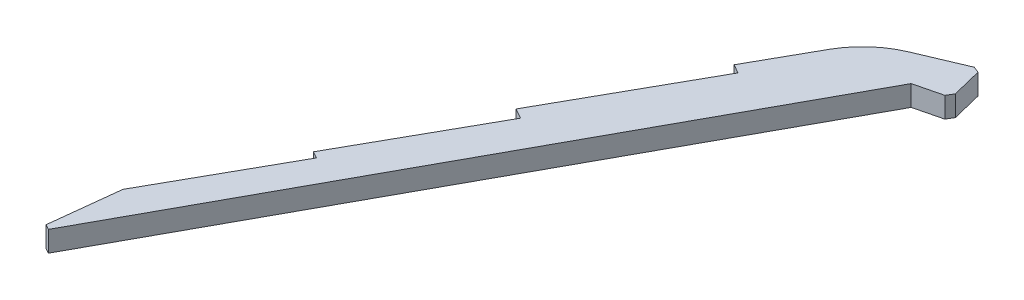
ISO-10303-21;
HEADER;
FILE_DESCRIPTION(('STEP AP214'),'2;1');
FILE_NAME('part.step','',(''),(''),'','','');
FILE_SCHEMA(('AUTOMOTIVE_DESIGN { 1 0 10303 214 1 1 1 1 }'));
ENDSEC;
DATA;
#1=APPLICATION_CONTEXT('core data for automotive mechanical design processes');
#2=APPLICATION_PROTOCOL_DEFINITION('international standard','automotive_design',2000,#1);
#3=PRODUCT_CONTEXT('',#1,'mechanical');
#4=PRODUCT('Part','Part','',(#3));
#5=PRODUCT_RELATED_PRODUCT_CATEGORY('part','',(#4));
#6=PRODUCT_DEFINITION_FORMATION('','',#4);
#7=PRODUCT_DEFINITION_CONTEXT('part definition',#1,'design');
#8=PRODUCT_DEFINITION('design','',#6,#7);
#9=PRODUCT_DEFINITION_SHAPE('','',#8);
#10=(LENGTH_UNIT() NAMED_UNIT(*) SI_UNIT(.MILLI.,.METRE.));
#11=(NAMED_UNIT(*) PLANE_ANGLE_UNIT() SI_UNIT($,.RADIAN.));
#12=(NAMED_UNIT(*) SI_UNIT($,.STERADIAN.) SOLID_ANGLE_UNIT());
#13=UNCERTAINTY_MEASURE_WITH_UNIT(LENGTH_MEASURE(1.E-05),#10,'distance_accuracy_value','');
#14=(GEOMETRIC_REPRESENTATION_CONTEXT(3) GLOBAL_UNCERTAINTY_ASSIGNED_CONTEXT((#13)) GLOBAL_UNIT_ASSIGNED_CONTEXT((#10,
#11,#12)) REPRESENTATION_CONTEXT('',''));
#15=CARTESIAN_POINT('',(0.,0.,0.));
#16=DIRECTION('',(0.,0.,1.));
#17=DIRECTION('',(1.,0.,0.));
#18=AXIS2_PLACEMENT_3D('',#15,#16,#17);
#19=CARTESIAN_POINT('',(-188.025009301798,-0.95,71.8127769293707));
#20=DIRECTION('',(-0.389853880750262,0.,-0.920876729896006));
#21=DIRECTION('',(-0.920876729896006,0.,0.389853880750262));
#22=AXIS2_PLACEMENT_3D('',#19,#20,#21);
#23=PLANE('',#22);
#24=DIRECTION('',(-0.920876729896006,0.,0.389853880750262));
#25=VECTOR('',#24,1.);
#26=CARTESIAN_POINT('',(-188.025009301798,0.95,71.8127769293707));
#27=LINE('',#26,#25);
#28=CARTESIAN_POINT('',(-188.485447666746,0.95,72.0077038697459));
#29=VERTEX_POINT('',#28);
#30=CARTESIAN_POINT('',(-192.732273807516,0.95,73.8056010237304));
#31=VERTEX_POINT('',#30);
#32=EDGE_CURVE('E159',#29,#31,#27,.T.);
#33=ORIENTED_EDGE('',*,*,#32,.F.);
#34=DIRECTION('',(0.,-1.,0.));
#35=VECTOR('',#34,1.);
#36=CARTESIAN_POINT('',(-188.485447666746,-0.95,72.0077038697459));
#37=LINE('',#36,#35);
#38=CARTESIAN_POINT('',(-188.485447666746,-0.95,72.0077038697459));
#39=VERTEX_POINT('',#38);
#40=EDGE_CURVE('E46',#29,#39,#37,.T.);
#41=ORIENTED_EDGE('',*,*,#40,.T.);
#42=DIRECTION('',(-0.920876729896006,0.,0.389853880750262));
#43=VECTOR('',#42,1.);
#44=CARTESIAN_POINT('',(-188.025009301798,-0.95,71.8127769293707));
#45=LINE('',#44,#43);
#46=CARTESIAN_POINT('',(-192.732273807516,-0.95,73.8056010237304));
#47=VERTEX_POINT('',#46);
#48=EDGE_CURVE('E204',#39,#47,#45,.T.);
#49=ORIENTED_EDGE('',*,*,#48,.T.);
#50=DIRECTION('',(0.,1.,0.));
#51=VECTOR('',#50,1.);
#52=CARTESIAN_POINT('',(-192.732273807516,-0.95,73.8056010237304));
#53=LINE('',#52,#51);
#54=EDGE_CURVE('E240',#47,#31,#53,.T.);
#55=ORIENTED_EDGE('',*,*,#54,.T.);
#56=EDGE_LOOP('',(#33,#41,#49,#55));
#57=FACE_BOUND('',#56,.T.);
#58=ADVANCED_FACE('F37',(#57),#23,.T.);
#59=CARTESIAN_POINT('',(-187.1201642957,-0.95,75.4856566385855));
#60=DIRECTION('',(0.970968749435326,0.,-0.239206370358316));
#61=DIRECTION('',(-0.239206370358316,0.,-0.970968749435326));
#62=AXIS2_PLACEMENT_3D('',#59,#60,#61);
#63=PLANE('',#62);
#64=DIRECTION('',(-0.239206370358316,0.,-0.970968749435326));
#65=VECTOR('',#64,1.);
#66=CARTESIAN_POINT('',(-187.1201642957,-0.95,75.4856566385855));
#67=LINE('',#66,#65);
#68=CARTESIAN_POINT('',(-187.239767480879,-0.95,75.0001722638678));
#69=VERTEX_POINT('',#68);
#70=CARTESIAN_POINT('',(-187.920612038745,-0.95,72.2365385532759));
#71=VERTEX_POINT('',#70);
#72=EDGE_CURVE('E170',#69,#71,#67,.T.);
#73=ORIENTED_EDGE('',*,*,#72,.T.);
#74=DIRECTION('',(0.,1.,0.));
#75=VECTOR('',#74,1.);
#76=CARTESIAN_POINT('',(-187.920612038745,-0.95,72.2365385532759));
#77=LINE('',#76,#75);
#78=CARTESIAN_POINT('',(-187.920612038745,0.95,72.2365385532759));
#79=VERTEX_POINT('',#78);
#80=EDGE_CURVE('E273',#71,#79,#77,.T.);
#81=ORIENTED_EDGE('',*,*,#80,.T.);
#82=DIRECTION('',(-0.239206370358316,0.,-0.970968749435326));
#83=VECTOR('',#82,1.);
#84=CARTESIAN_POINT('',(-187.1201642957,0.95,75.4856566385855));
#85=LINE('',#84,#83);
#86=CARTESIAN_POINT('',(-187.239767480879,0.95,75.0001722638678));
#87=VERTEX_POINT('',#86);
#88=EDGE_CURVE('E202',#87,#79,#85,.T.);
#89=ORIENTED_EDGE('',*,*,#88,.F.);
#90=DIRECTION('',(0.,-1.,0.));
#91=VECTOR('',#90,1.);
#92=CARTESIAN_POINT('',(-187.239767480879,-0.95,75.0001722638678));
#93=LINE('',#92,#91);
#94=EDGE_CURVE('E269',#87,#69,#93,.T.);
#95=ORIENTED_EDGE('',*,*,#94,.T.);
#96=EDGE_LOOP('',(#73,#81,#89,#95));
#97=FACE_BOUND('',#96,.T.);
#98=ADVANCED_FACE('F279',(#97),#63,.T.);
#99=CARTESIAN_POINT('',(-190.089143958552,-0.95,76.2170899099771));
#100=DIRECTION('',(0.239206370358314,0.,0.970968749435326));
#101=DIRECTION('',(0.970968749435326,0.,-0.239206370358314));
#102=AXIS2_PLACEMENT_3D('',#99,#100,#101);
#103=PLANE('',#102);
#104=DIRECTION('',(0.970968749435326,0.,-0.239206370358314));
#105=VECTOR('',#104,1.);
#106=CARTESIAN_POINT('',(-190.089143958552,-0.95,76.2170899099771));
#107=LINE('',#106,#105);
#108=CARTESIAN_POINT('',(-190.089143958552,-0.95,76.2170899099771));
#109=VERTEX_POINT('',#108);
#110=CARTESIAN_POINT('',(-187.605648670418,-0.95,75.6052598237646));
#111=VERTEX_POINT('',#110);
#112=EDGE_CURVE('E233',#109,#111,#107,.T.);
#113=ORIENTED_EDGE('',*,*,#112,.T.);
#114=DIRECTION('',(0.,1.,0.));
#115=VECTOR('',#114,1.);
#116=CARTESIAN_POINT('',(-187.605648670418,-0.95,75.6052598237646));
#117=LINE('',#116,#115);
#118=CARTESIAN_POINT('',(-187.605648670418,0.95,75.6052598237646));
#119=VERTEX_POINT('',#118);
#120=EDGE_CURVE('E264',#111,#119,#117,.T.);
#121=ORIENTED_EDGE('',*,*,#120,.T.);
#122=DIRECTION('',(0.970968749435326,0.,-0.239206370358314));
#123=VECTOR('',#122,1.);
#124=CARTESIAN_POINT('',(-190.089143958552,0.95,76.2170899099771));
#125=LINE('',#124,#123);
#126=CARTESIAN_POINT('',(-190.089143958552,0.95,76.2170899099771));
#127=VERTEX_POINT('',#126);
#128=EDGE_CURVE('E199',#127,#119,#125,.T.);
#129=ORIENTED_EDGE('',*,*,#128,.F.);
#130=DIRECTION('',(0.,1.,0.));
#131=VECTOR('',#130,1.);
#132=CARTESIAN_POINT('',(-190.089143958552,-0.95,76.2170899099771));
#133=LINE('',#132,#131);
#134=EDGE_CURVE('E238',#109,#127,#133,.T.);
#135=ORIENTED_EDGE('',*,*,#134,.F.);
#136=EDGE_LOOP('',(#113,#121,#129,#135));
#137=FACE_BOUND('',#136,.T.);
#138=ADVANCED_FACE('F290',(#137),#103,.T.);
#139=CARTESIAN_POINT('',(-218.168094082318,-0.95,127.536139913308));
#140=DIRECTION('',(0.877271490152052,0.,0.479994513058637));
#141=DIRECTION('',(0.479994513058637,0.,-0.877271490152052));
#142=AXIS2_PLACEMENT_3D('',#139,#140,#141);
#143=PLANE('',#142);
#144=ORIENTED_EDGE('',*,*,#134,.T.);
#145=DIRECTION('',(0.479994513058637,0.,-0.877271490152052));
#146=VECTOR('',#145,1.);
#147=CARTESIAN_POINT('',(-218.168094082318,0.95,127.536139913308));
#148=LINE('',#147,#146);
#149=CARTESIAN_POINT('',(-218.168094082318,0.95,127.536139913308));
#150=VERTEX_POINT('',#149);
#151=EDGE_CURVE('E196',#150,#127,#148,.T.);
#152=ORIENTED_EDGE('',*,*,#151,.F.);
#153=DIRECTION('',(0.,1.,0.));
#154=VECTOR('',#153,1.);
#155=CARTESIAN_POINT('',(-218.168094082318,-0.95,127.536139913308));
#156=LINE('',#155,#154);
#157=CARTESIAN_POINT('',(-218.168094082318,-0.95,127.536139913308));
#158=VERTEX_POINT('',#157);
#159=EDGE_CURVE('E241',#158,#150,#156,.T.);
#160=ORIENTED_EDGE('',*,*,#159,.F.);
#161=DIRECTION('',(0.479994513058637,0.,-0.877271490152052));
#162=VECTOR('',#161,1.);
#163=CARTESIAN_POINT('',(-218.168094082318,-0.95,127.536139913308));
#164=LINE('',#163,#162);
#165=EDGE_CURVE('E230',#158,#109,#164,.T.);
#166=ORIENTED_EDGE('',*,*,#165,.T.);
#167=EDGE_LOOP('',(#144,#152,#160,#166));
#168=FACE_BOUND('',#167,.T.);
#169=ADVANCED_FACE('F297',(#168),#143,.T.);
#170=CARTESIAN_POINT('',(-218.646393726015,-0.95,127.274440761849));
#171=DIRECTION('',(-0.479994513058623,0.,0.87727149015206));
#172=DIRECTION('',(0.87727149015206,0.,0.479994513058623));
#173=AXIS2_PLACEMENT_3D('',#170,#171,#172);
#174=PLANE('',#173);
#175=ORIENTED_EDGE('',*,*,#159,.T.);
#176=DIRECTION('',(0.87727149015206,0.,0.479994513058623));
#177=VECTOR('',#176,1.);
#178=CARTESIAN_POINT('',(-218.646393726015,0.95,127.274440761849));
#179=LINE('',#178,#177);
#180=CARTESIAN_POINT('',(-218.646393726015,0.95,127.274440761849));
#181=VERTEX_POINT('',#180);
#182=EDGE_CURVE('E193',#181,#150,#179,.T.);
#183=ORIENTED_EDGE('',*,*,#182,.F.);
#184=DIRECTION('',(0.,1.,0.));
#185=VECTOR('',#184,1.);
#186=CARTESIAN_POINT('',(-218.646393726015,-0.95,127.274440761849));
#187=LINE('',#186,#185);
#188=CARTESIAN_POINT('',(-218.646393726015,-0.95,127.274440761849));
#189=VERTEX_POINT('',#188);
#190=EDGE_CURVE('E243',#189,#181,#187,.T.);
#191=ORIENTED_EDGE('',*,*,#190,.F.);
#192=DIRECTION('',(0.87727149015206,0.,0.479994513058623));
#193=VECTOR('',#192,1.);
#194=CARTESIAN_POINT('',(-218.646393726015,-0.95,127.274440761849));
#195=LINE('',#194,#193);
#196=EDGE_CURVE('E227',#189,#158,#195,.T.);
#197=ORIENTED_EDGE('',*,*,#196,.T.);
#198=EDGE_LOOP('',(#175,#183,#191,#197));
#199=FACE_BOUND('',#198,.T.);
#200=ADVANCED_FACE('F301',(#199),#174,.T.);
#201=CARTESIAN_POINT('',(-217.92662704428,-0.95,120.912479789973));
#202=DIRECTION('',(-0.993660914680316,0.,-0.112418800192304));
#203=DIRECTION('',(-0.112418800192304,0.,0.993660914680316));
#204=AXIS2_PLACEMENT_3D('',#201,#202,#203);
#205=PLANE('',#204);
#206=ORIENTED_EDGE('',*,*,#190,.T.);
#207=DIRECTION('',(-0.112418800192304,0.,0.993660914680316));
#208=VECTOR('',#207,1.);
#209=CARTESIAN_POINT('',(-217.92662704428,0.95,120.912479789973));
#210=LINE('',#209,#208);
#211=CARTESIAN_POINT('',(-217.92662704428,0.95,120.912479789973));
#212=VERTEX_POINT('',#211);
#213=EDGE_CURVE('E190',#212,#181,#210,.T.);
#214=ORIENTED_EDGE('',*,*,#213,.F.);
#215=DIRECTION('',(0.,1.,0.));
#216=VECTOR('',#215,1.);
#217=CARTESIAN_POINT('',(-217.92662704428,-0.95,120.912479789973));
#218=LINE('',#217,#216);
#219=CARTESIAN_POINT('',(-217.92662704428,-0.95,120.912479789973));
#220=VERTEX_POINT('',#219);
#221=EDGE_CURVE('E245',#220,#212,#218,.T.);
#222=ORIENTED_EDGE('',*,*,#221,.F.);
#223=DIRECTION('',(-0.112418800192304,0.,0.993660914680316));
#224=VECTOR('',#223,1.);
#225=CARTESIAN_POINT('',(-217.92662704428,-0.95,120.912479789973));
#226=LINE('',#225,#224);
#227=EDGE_CURVE('E224',#220,#189,#226,.T.);
#228=ORIENTED_EDGE('',*,*,#227,.T.);
#229=EDGE_LOOP('',(#206,#214,#222,#228));
#230=FACE_BOUND('',#229,.T.);
#231=ADVANCED_FACE('F305',(#230),#205,.T.);
#232=CARTESIAN_POINT('',(-211.528903603608,-0.95,109.504124230012));
#233=DIRECTION('',(-0.872211076017126,0.,-0.489129674905384));
#234=DIRECTION('',(-0.489129674905384,0.,0.872211076017126));
#235=AXIS2_PLACEMENT_3D('',#232,#233,#234);
#236=PLANE('',#235);
#237=ORIENTED_EDGE('',*,*,#221,.T.);
#238=DIRECTION('',(-0.489129674905384,0.,0.872211076017126));
#239=VECTOR('',#238,1.);
#240=CARTESIAN_POINT('',(-211.528903603608,0.95,109.504124230012));
#241=LINE('',#240,#239);
#242=CARTESIAN_POINT('',(-211.528903603608,0.95,109.504124230012));
#243=VERTEX_POINT('',#242);
#244=EDGE_CURVE('E187',#243,#212,#241,.T.);
#245=ORIENTED_EDGE('',*,*,#244,.F.);
#246=DIRECTION('',(0.,1.,0.));
#247=VECTOR('',#246,1.);
#248=CARTESIAN_POINT('',(-211.528903603608,-0.95,109.504124230012));
#249=LINE('',#248,#247);
#250=CARTESIAN_POINT('',(-211.528903603608,-0.95,109.504124230012));
#251=VERTEX_POINT('',#250);
#252=EDGE_CURVE('E247',#251,#243,#249,.T.);
#253=ORIENTED_EDGE('',*,*,#252,.F.);
#254=DIRECTION('',(-0.489129674905384,0.,0.872211076017126));
#255=VECTOR('',#254,1.);
#256=CARTESIAN_POINT('',(-211.528903603608,-0.95,109.504124230012));
#257=LINE('',#256,#255);
#258=EDGE_CURVE('E221',#251,#220,#257,.T.);
#259=ORIENTED_EDGE('',*,*,#258,.T.);
#260=EDGE_LOOP('',(#237,#245,#253,#259));
#261=FACE_BOUND('',#260,.T.);
#262=ADVANCED_FACE('F310',(#261),#236,.T.);
#263=CARTESIAN_POINT('',(-212.153344095367,-0.95,109.153942510094));
#264=DIRECTION('',(-0.48912967490538,0.,0.872211076017129));
#265=DIRECTION('',(0.872211076017129,0.,0.48912967490538));
#266=AXIS2_PLACEMENT_3D('',#263,#264,#265);
#267=PLANE('',#266);
#268=ORIENTED_EDGE('',*,*,#252,.T.);
#269=DIRECTION('',(0.872211076017129,0.,0.48912967490538));
#270=VECTOR('',#269,1.);
#271=CARTESIAN_POINT('',(-212.153344095367,0.95,109.153942510094));
#272=LINE('',#271,#270);
#273=CARTESIAN_POINT('',(-212.153344095367,0.95,109.153942510094));
#274=VERTEX_POINT('',#273);
#275=EDGE_CURVE('E184',#274,#243,#272,.T.);
#276=ORIENTED_EDGE('',*,*,#275,.F.);
#277=DIRECTION('',(0.,1.,0.));
#278=VECTOR('',#277,1.);
#279=CARTESIAN_POINT('',(-212.153344095367,-0.95,109.153942510094));
#280=LINE('',#279,#278);
#281=CARTESIAN_POINT('',(-212.153344095367,-0.95,109.153942510094));
#282=VERTEX_POINT('',#281);
#283=EDGE_CURVE('E249',#282,#274,#280,.T.);
#284=ORIENTED_EDGE('',*,*,#283,.F.);
#285=DIRECTION('',(0.872211076017129,0.,0.48912967490538));
#286=VECTOR('',#285,1.);
#287=CARTESIAN_POINT('',(-212.153344095367,-0.95,109.153942510094));
#288=LINE('',#287,#286);
#289=EDGE_CURVE('E218',#282,#251,#288,.T.);
#290=ORIENTED_EDGE('',*,*,#289,.T.);
#291=EDGE_LOOP('',(#268,#276,#284,#290));
#292=FACE_BOUND('',#291,.T.);
#293=ADVANCED_FACE('F313',(#292),#267,.T.);
#294=CARTESIAN_POINT('',(-205.305528646691,-0.95,96.9429874458543));
#295=DIRECTION('',(-0.872211076017119,0.,-0.489129674905398));
#296=DIRECTION('',(-0.489129674905398,0.,0.872211076017119));
#297=AXIS2_PLACEMENT_3D('',#294,#295,#296);
#298=PLANE('',#297);
#299=ORIENTED_EDGE('',*,*,#283,.T.);
#300=DIRECTION('',(-0.489129674905398,0.,0.872211076017118));
#301=VECTOR('',#300,1.);
#302=CARTESIAN_POINT('',(-205.305528646691,0.95,96.9429874458543));
#303=LINE('',#302,#301);
#304=CARTESIAN_POINT('',(-205.305528646691,0.95,96.9429874458543));
#305=VERTEX_POINT('',#304);
#306=EDGE_CURVE('E181',#305,#274,#303,.T.);
#307=ORIENTED_EDGE('',*,*,#306,.F.);
#308=DIRECTION('',(0.,1.,0.));
#309=VECTOR('',#308,1.);
#310=CARTESIAN_POINT('',(-205.305528646691,-0.95,96.9429874458543));
#311=LINE('',#310,#309);
#312=CARTESIAN_POINT('',(-205.305528646691,-0.95,96.9429874458543));
#313=VERTEX_POINT('',#312);
#314=EDGE_CURVE('E251',#313,#305,#311,.T.);
#315=ORIENTED_EDGE('',*,*,#314,.F.);
#316=DIRECTION('',(-0.489129674905398,0.,0.872211076017118));
#317=VECTOR('',#316,1.);
#318=CARTESIAN_POINT('',(-205.305528646691,-0.95,96.9429874458543));
#319=LINE('',#318,#317);
#320=EDGE_CURVE('E215',#313,#282,#319,.T.);
#321=ORIENTED_EDGE('',*,*,#320,.T.);
#322=EDGE_LOOP('',(#299,#307,#315,#321));
#323=FACE_BOUND('',#322,.T.);
#324=ADVANCED_FACE('F317',(#323),#298,.T.);
#325=CARTESIAN_POINT('',(-206.244927344977,-0.95,96.4161794374106));
#326=DIRECTION('',(-0.4891296749054,0.,0.872211076017117));
#327=DIRECTION('',(0.872211076017117,0.,0.4891296749054));
#328=AXIS2_PLACEMENT_3D('',#325,#326,#327);
#329=PLANE('',#328);
#330=ORIENTED_EDGE('',*,*,#314,.T.);
#331=DIRECTION('',(0.872211076017117,0.,0.4891296749054));
#332=VECTOR('',#331,1.);
#333=CARTESIAN_POINT('',(-206.244927344977,0.95,96.4161794374106));
#334=LINE('',#333,#332);
#335=CARTESIAN_POINT('',(-206.244927344977,0.95,96.4161794374106));
#336=VERTEX_POINT('',#335);
#337=EDGE_CURVE('E175',#336,#305,#334,.T.);
#338=ORIENTED_EDGE('',*,*,#337,.F.);
#339=DIRECTION('',(0.,1.,0.));
#340=VECTOR('',#339,1.);
#341=CARTESIAN_POINT('',(-206.244927344977,-0.95,96.4161794374106));
#342=LINE('',#341,#340);
#343=CARTESIAN_POINT('',(-206.244927344977,-0.95,96.4161794374106));
#344=VERTEX_POINT('',#343);
#345=EDGE_CURVE('E253',#344,#336,#342,.T.);
#346=ORIENTED_EDGE('',*,*,#345,.F.);
#347=DIRECTION('',(0.872211076017117,0.,0.4891296749054));
#348=VECTOR('',#347,1.);
#349=CARTESIAN_POINT('',(-206.244927344977,-0.95,96.4161794374106));
#350=LINE('',#349,#348);
#351=EDGE_CURVE('E212',#344,#313,#350,.T.);
#352=ORIENTED_EDGE('',*,*,#351,.T.);
#353=EDGE_LOOP('',(#330,#338,#346,#352));
#354=FACE_BOUND('',#353,.T.);
#355=ADVANCED_FACE('F322',(#354),#329,.T.);
#356=CARTESIAN_POINT('',(-198.907982221396,-0.95,83.3330132971538));
#357=DIRECTION('',(-0.87221107601712,0.,-0.489129674905394));
#358=DIRECTION('',(-0.489129674905394,0.,0.87221107601712));
#359=AXIS2_PLACEMENT_3D('',#356,#357,#358);
#360=PLANE('',#359);
#361=ORIENTED_EDGE('',*,*,#345,.T.);
#362=DIRECTION('',(-0.489129674905395,0.,0.87221107601712));
#363=VECTOR('',#362,1.);
#364=CARTESIAN_POINT('',(-198.907982221396,0.95,83.3330132971538));
#365=LINE('',#364,#363);
#366=CARTESIAN_POINT('',(-198.907982221396,0.95,83.3330132971538));
#367=VERTEX_POINT('',#366);
#368=EDGE_CURVE('E173',#367,#336,#365,.T.);
#369=ORIENTED_EDGE('',*,*,#368,.F.);
#370=DIRECTION('',(0.,1.,0.));
#371=VECTOR('',#370,1.);
#372=CARTESIAN_POINT('',(-198.907982221396,-0.95,83.3330132971538));
#373=LINE('',#372,#371);
#374=CARTESIAN_POINT('',(-198.907982221396,-0.95,83.3330132971538));
#375=VERTEX_POINT('',#374);
#376=EDGE_CURVE('E169',#375,#367,#373,.T.);
#377=ORIENTED_EDGE('',*,*,#376,.F.);
#378=DIRECTION('',(-0.489129674905395,0.,0.87221107601712));
#379=VECTOR('',#378,1.);
#380=CARTESIAN_POINT('',(-198.907982221396,-0.95,83.3330132971538));
#381=LINE('',#380,#379);
#382=EDGE_CURVE('E209',#375,#344,#381,.T.);
#383=ORIENTED_EDGE('',*,*,#382,.T.);
#384=EDGE_LOOP('',(#361,#369,#377,#383));
#385=FACE_BOUND('',#384,.T.);
#386=ADVANCED_FACE('F324',(#385),#360,.T.);
#387=CARTESIAN_POINT('',(-199.736508361823,-0.95,82.8683818187642));
#388=DIRECTION('',(-0.489129674905396,0.,0.87221107601712));
#389=DIRECTION('',(0.87221107601712,0.,0.489129674905396));
#390=AXIS2_PLACEMENT_3D('',#387,#388,#389);
#391=PLANE('',#390);
#392=ORIENTED_EDGE('',*,*,#376,.T.);
#393=DIRECTION('',(0.87221107601712,0.,0.489129674905396));
#394=VECTOR('',#393,1.);
#395=CARTESIAN_POINT('',(-199.736508361823,0.95,82.8683818187642));
#396=LINE('',#395,#394);
#397=CARTESIAN_POINT('',(-199.736508361823,0.95,82.8683818187642));
#398=VERTEX_POINT('',#397);
#399=EDGE_CURVE('E153',#398,#367,#396,.T.);
#400=ORIENTED_EDGE('',*,*,#399,.F.);
#401=DIRECTION('',(0.,1.,0.));
#402=VECTOR('',#401,1.);
#403=CARTESIAN_POINT('',(-199.736508361823,-0.95,82.8683818187642));
#404=LINE('',#403,#402);
#405=CARTESIAN_POINT('',(-199.736508361823,-0.95,82.8683818187642));
#406=VERTEX_POINT('',#405);
#407=EDGE_CURVE('E162',#406,#398,#404,.T.);
#408=ORIENTED_EDGE('',*,*,#407,.F.);
#409=DIRECTION('',(0.87221107601712,0.,0.489129674905396));
#410=VECTOR('',#409,1.);
#411=CARTESIAN_POINT('',(-199.736508361823,-0.95,82.8683818187642));
#412=LINE('',#411,#410);
#413=EDGE_CURVE('E207',#406,#375,#412,.T.);
#414=ORIENTED_EDGE('',*,*,#413,.T.);
#415=EDGE_LOOP('',(#392,#400,#408,#414));
#416=FACE_BOUND('',#415,.T.);
#417=ADVANCED_FACE('F172',(#416),#391,.T.);
#418=CARTESIAN_POINT('',(-195.252497914905,-0.95,74.8725398622619));
#419=DIRECTION('',(-0.872211076017122,0.,-0.489129674905392));
#420=DIRECTION('',(-0.489129674905392,0.,0.872211076017122));
#421=AXIS2_PLACEMENT_3D('',#418,#419,#420);
#422=PLANE('',#421);
#423=DIRECTION('',(-0.489129674905392,0.,0.872211076017122));
#424=VECTOR('',#423,1.);
#425=CARTESIAN_POINT('',(-195.252497914905,0.95,74.8725398622619));
#426=LINE('',#425,#424);
#427=CARTESIAN_POINT('',(-196.59113136965,0.95,77.2595774636553));
#428=VERTEX_POINT('',#427);
#429=EDGE_CURVE('E148',#428,#398,#426,.T.);
#430=ORIENTED_EDGE('',*,*,#429,.F.);
#431=DIRECTION('',(0.,1.,0.));
#432=VECTOR('',#431,1.);
#433=CARTESIAN_POINT('',(-196.59113136965,-0.95,77.2595774636553));
#434=LINE('',#433,#432);
#435=CARTESIAN_POINT('',(-196.59113136965,-0.95,77.2595774636553));
#436=VERTEX_POINT('',#435);
#437=EDGE_CURVE('E259',#428,#436,#434,.F.);
#438=ORIENTED_EDGE('',*,*,#437,.T.);
#439=DIRECTION('',(-0.489129674905392,0.,0.872211076017122));
#440=VECTOR('',#439,1.);
#441=CARTESIAN_POINT('',(-195.252497914905,-0.95,74.8725398622619));
#442=LINE('',#441,#440);
#443=EDGE_CURVE('E165',#436,#406,#442,.T.);
#444=ORIENTED_EDGE('',*,*,#443,.T.);
#445=ORIENTED_EDGE('',*,*,#407,.T.);
#446=EDGE_LOOP('',(#430,#438,#444,#445));
#447=FACE_BOUND('',#446,.T.);
#448=ADVANCED_FACE('F163',(#447),#422,.T.);
#449=CARTESIAN_POINT('',(0.,-0.95,0.));
#450=DIRECTION('',(0.,-1.,0.));
#451=DIRECTION('',(0.,0.,-1.));
#452=AXIS2_PLACEMENT_3D('',#449,#450,#451);
#453=PLANE('',#452);
#454=ORIENTED_EDGE('',*,*,#48,.F.);
#455=DIRECTION('',(-0.926826503096767,0.,-0.37548985759594));
#456=VECTOR('',#455,1.);
#457=CARTESIAN_POINT('',(-51.634745152347,-0.95,127.450713567183));
#458=LINE('',#457,#456);
#459=EDGE_CURVE('E11',#39,#71,#458,.F.);
#460=ORIENTED_EDGE('',*,*,#459,.T.);
#461=ORIENTED_EDGE('',*,*,#72,.F.);
#462=DIRECTION('',(0.517434140462591,0.,-0.855723033629304));
#463=VECTOR('',#462,1.);
#464=CARTESIAN_POINT('',(-103.899950113081,-0.95,-62.8256798848276));
#465=LINE('',#464,#463);
#466=EDGE_CURVE('E271',#69,#111,#465,.F.);
#467=ORIENTED_EDGE('',*,*,#466,.T.);
#468=ORIENTED_EDGE('',*,*,#112,.F.);
#469=ORIENTED_EDGE('',*,*,#165,.F.);
#470=ORIENTED_EDGE('',*,*,#196,.F.);
#471=ORIENTED_EDGE('',*,*,#227,.F.);
#472=ORIENTED_EDGE('',*,*,#258,.F.);
#473=ORIENTED_EDGE('',*,*,#289,.F.);
#474=ORIENTED_EDGE('',*,*,#320,.F.);
#475=ORIENTED_EDGE('',*,*,#351,.F.);
#476=ORIENTED_EDGE('',*,*,#382,.F.);
#477=ORIENTED_EDGE('',*,*,#413,.F.);
#478=ORIENTED_EDGE('',*,*,#443,.F.);
#479=CARTESIAN_POINT('',(-189.613442761514,-0.95,81.1726148628985));
#480=DIRECTION('',(0.,-1.,0.));
#481=DIRECTION('',(0.,0.,-1.));
#482=AXIS2_PLACEMENT_3D('',#479,#480,#481);
#483=CIRCLE('',#482,8.);
#484=EDGE_CURVE('E261',#436,#47,#483,.T.);
#485=ORIENTED_EDGE('',*,*,#484,.T.);
#486=EDGE_LOOP('',(#454,#460,#461,#467,#468,#469,#470,#471,#472,#473,#474,#475,#476,#477,#478,#485));
#487=FACE_BOUND('',#486,.T.);
#488=ADVANCED_FACE('F294',(#487),#453,.T.);
#489=CARTESIAN_POINT('',(0.,0.95,0.));
#490=DIRECTION('',(0.,-1.,0.));
#491=DIRECTION('',(0.,0.,-1.));
#492=AXIS2_PLACEMENT_3D('',#489,#490,#491);
#493=PLANE('',#492);
#494=ORIENTED_EDGE('',*,*,#88,.T.);
#495=DIRECTION('',(0.926826503096767,0.,0.37548985759594));
#496=VECTOR('',#495,1.);
#497=CARTESIAN_POINT('',(-187.920612038745,0.95,72.2365385532759));
#498=LINE('',#497,#496);
#499=EDGE_CURVE('E60',#79,#29,#498,.F.);
#500=ORIENTED_EDGE('',*,*,#499,.T.);
#501=ORIENTED_EDGE('',*,*,#32,.T.);
#502=CARTESIAN_POINT('',(-189.613442761514,0.95,81.1726148628985));
#503=DIRECTION('',(0.,-1.,0.));
#504=DIRECTION('',(0.,0.,-1.));
#505=AXIS2_PLACEMENT_3D('',#502,#503,#504);
#506=CIRCLE('',#505,8.);
#507=EDGE_CURVE('E156',#31,#428,#506,.F.);
#508=ORIENTED_EDGE('',*,*,#507,.T.);
#509=ORIENTED_EDGE('',*,*,#429,.T.);
#510=ORIENTED_EDGE('',*,*,#399,.T.);
#511=ORIENTED_EDGE('',*,*,#368,.T.);
#512=ORIENTED_EDGE('',*,*,#337,.T.);
#513=ORIENTED_EDGE('',*,*,#306,.T.);
#514=ORIENTED_EDGE('',*,*,#275,.T.);
#515=ORIENTED_EDGE('',*,*,#244,.T.);
#516=ORIENTED_EDGE('',*,*,#213,.T.);
#517=ORIENTED_EDGE('',*,*,#182,.T.);
#518=ORIENTED_EDGE('',*,*,#151,.T.);
#519=ORIENTED_EDGE('',*,*,#128,.T.);
#520=DIRECTION('',(-0.517434140462591,0.,0.855723033629304));
#521=VECTOR('',#520,1.);
#522=CARTESIAN_POINT('',(-187.605648670418,0.95,75.6052598237646));
#523=LINE('',#522,#521);
#524=EDGE_CURVE('E267',#119,#87,#523,.F.);
#525=ORIENTED_EDGE('',*,*,#524,.T.);
#526=EDGE_LOOP('',(#494,#500,#501,#508,#509,#510,#511,#512,#513,#514,#515,#516,#517,#518,#519,#525));
#527=FACE_BOUND('',#526,.T.);
#528=ADVANCED_FACE('F150',(#527),#493,.F.);
#529=CARTESIAN_POINT('',(-189.613442761514,-0.95,81.1726148628985));
#530=DIRECTION('',(0.,1.,0.));
#531=DIRECTION('',(0.,0.,1.));
#532=AXIS2_PLACEMENT_3D('',#529,#530,#531);
#533=CYLINDRICAL_SURFACE('',#532,8.);
#534=ORIENTED_EDGE('',*,*,#484,.F.);
#535=ORIENTED_EDGE('',*,*,#437,.F.);
#536=ORIENTED_EDGE('',*,*,#507,.F.);
#537=ORIENTED_EDGE('',*,*,#54,.F.);
#538=EDGE_LOOP('',(#534,#535,#536,#537));
#539=FACE_BOUND('',#538,.T.);
#540=ADVANCED_FACE('F328',(#539),#533,.T.);
#541=CARTESIAN_POINT('',(-187.605648670418,-0.95,75.6052598237646));
#542=DIRECTION('',(-0.855723033629304,0.,-0.517434140462591));
#543=DIRECTION('',(0.,1.,0.));
#544=AXIS2_PLACEMENT_3D('',#541,#542,#543);
#545=PLANE('',#544);
#546=ORIENTED_EDGE('',*,*,#466,.F.);
#547=ORIENTED_EDGE('',*,*,#94,.F.);
#548=ORIENTED_EDGE('',*,*,#524,.F.);
#549=ORIENTED_EDGE('',*,*,#120,.F.);
#550=EDGE_LOOP('',(#546,#547,#548,#549));
#551=FACE_BOUND('',#550,.T.);
#552=ADVANCED_FACE('F288',(#551),#545,.F.);
#553=CARTESIAN_POINT('',(-187.920612038745,-0.95,72.2365385532759));
#554=DIRECTION('',(-0.37548985759594,0.,0.926826503096767));
#555=DIRECTION('',(0.,1.,0.));
#556=AXIS2_PLACEMENT_3D('',#553,#554,#555);
#557=PLANE('',#556);
#558=ORIENTED_EDGE('',*,*,#459,.F.);
#559=ORIENTED_EDGE('',*,*,#40,.F.);
#560=ORIENTED_EDGE('',*,*,#499,.F.);
#561=ORIENTED_EDGE('',*,*,#80,.F.);
#562=EDGE_LOOP('',(#558,#559,#560,#561));
#563=FACE_BOUND('',#562,.T.);
#564=ADVANCED_FACE('F40',(#563),#557,.F.);
#565=CLOSED_SHELL('',(#58,#98,#138,#169,#200,#231,#262,#293,#324,#355,#386,#417,#448,#488,#528,
#540,#552,#564));
#566=MANIFOLD_SOLID_BREP('B2',#565);
#567=ADVANCED_BREP_SHAPE_REPRESENTATION('',(#18,#566),#14);
#568=SHAPE_DEFINITION_REPRESENTATION(#9,#567);
ENDSEC;
END-ISO-10303-21;
